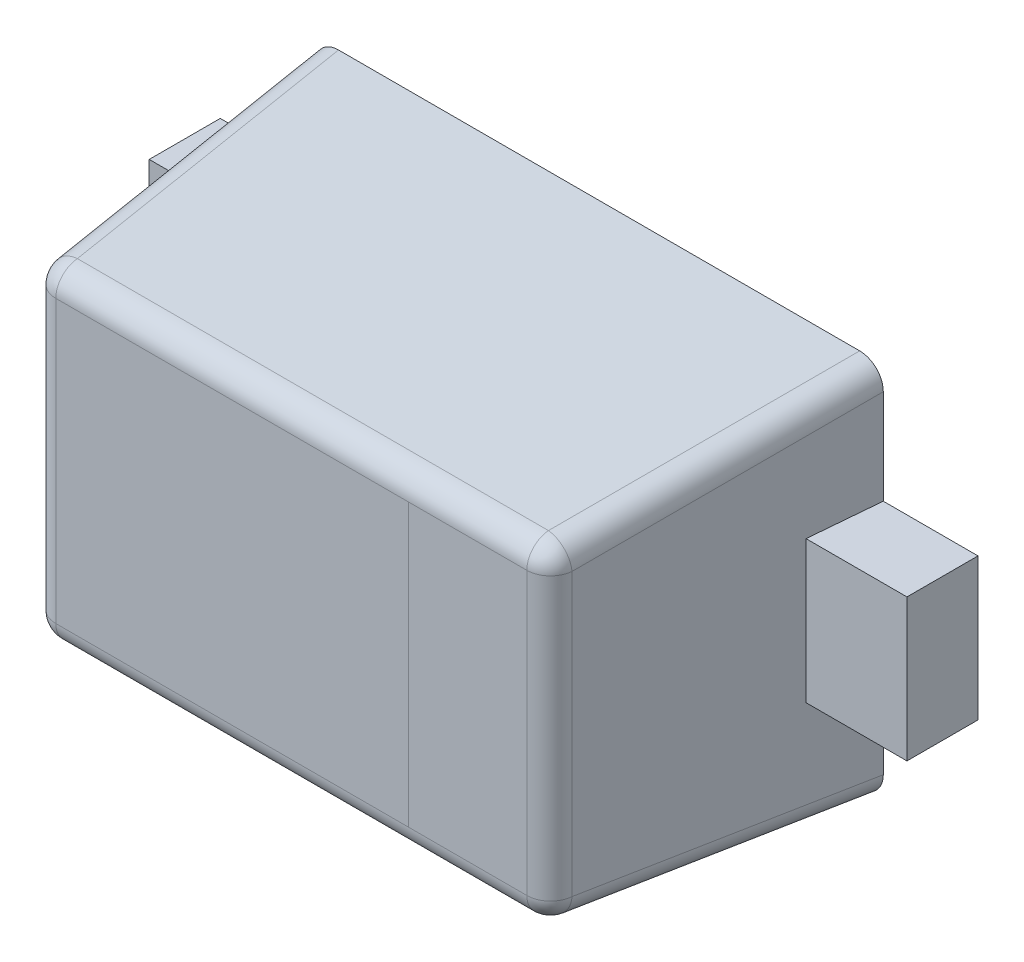
ISO-10303-21;
HEADER;
FILE_DESCRIPTION(('STEP AP214'),'2;1');
FILE_NAME('part.step','',(''),(''),'','','');
FILE_SCHEMA(('AUTOMOTIVE_DESIGN { 1 0 10303 214 1 1 1 1 }'));
ENDSEC;
DATA;
#1=APPLICATION_CONTEXT('core data for automotive mechanical design processes');
#2=APPLICATION_PROTOCOL_DEFINITION('international standard','automotive_design',2000,#1);
#3=PRODUCT_CONTEXT('',#1,'mechanical');
#4=PRODUCT('Part','Part','',(#3));
#5=PRODUCT_RELATED_PRODUCT_CATEGORY('part','',(#4));
#6=PRODUCT_DEFINITION_FORMATION('','',#4);
#7=PRODUCT_DEFINITION_CONTEXT('part definition',#1,'design');
#8=PRODUCT_DEFINITION('design','',#6,#7);
#9=PRODUCT_DEFINITION_SHAPE('','',#8);
#10=(LENGTH_UNIT() NAMED_UNIT(*) SI_UNIT(.MILLI.,.METRE.));
#11=(NAMED_UNIT(*) PLANE_ANGLE_UNIT() SI_UNIT($,.RADIAN.));
#12=(NAMED_UNIT(*) SI_UNIT($,.STERADIAN.) SOLID_ANGLE_UNIT());
#13=UNCERTAINTY_MEASURE_WITH_UNIT(LENGTH_MEASURE(1.E-05),#10,'distance_accuracy_value','');
#14=(GEOMETRIC_REPRESENTATION_CONTEXT(3) GLOBAL_UNCERTAINTY_ASSIGNED_CONTEXT((#13)) GLOBAL_UNIT_ASSIGNED_CONTEXT((#10,
#11,#12)) REPRESENTATION_CONTEXT('',''));
#15=CARTESIAN_POINT('',(0.,0.,0.));
#16=DIRECTION('',(0.,0.,1.));
#17=DIRECTION('',(1.,0.,0.));
#18=AXIS2_PLACEMENT_3D('',#15,#16,#17);
#19=CARTESIAN_POINT('',(8.12799989944324E-05,0.000121891586089262,0.649999999999999));
#20=DIRECTION('',(0.,-4.37113882867379E-08,0.999999999999999));
#21=DIRECTION('',(0.,-0.999999999999999,-4.37113882867379E-08));
#22=AXIS2_PLACEMENT_3D('',#19,#20,#21);
#23=PLANE('',#22);
#24=DIRECTION('',(1.,0.,0.));
#25=VECTOR('',#24,1.);
#26=CARTESIAN_POINT('',(0.543213648707144,-0.297193918421188,0.649999987003913));
#27=LINE('',#26,#25);
#28=CARTESIAN_POINT('',(-0.497234530008284,-0.297193918421189,0.649999987003913));
#29=VERTEX_POINT('',#28);
#30=CARTESIAN_POINT('',(0.247397090006273,-0.297193918421189,0.649999987003913));
#31=VERTEX_POINT('',#30);
#32=EDGE_CURVE('E11',#29,#31,#27,.T.);
#33=ORIENTED_EDGE('',*,*,#32,.T.);
#34=DIRECTION('',(0.,0.999999999999999,4.37113882867379E-08));
#35=VECTOR('',#34,1.);
#36=CARTESIAN_POINT('',(0.247397090006273,0.000121891586089307,0.649999999999999));
#37=LINE('',#36,#35);
#38=CARTESIAN_POINT('',(0.247397090006273,0.297437701593367,0.650000012996086));
#39=VERTEX_POINT('',#38);
#40=EDGE_CURVE('E23',#31,#39,#37,.T.);
#41=ORIENTED_EDGE('',*,*,#40,.T.);
#42=DIRECTION('',(-1.,0.,0.));
#43=VECTOR('',#42,1.);
#44=CARTESIAN_POINT('',(-0.543051088709155,0.297437701593367,0.650000012996086));
#45=LINE('',#44,#43);
#46=CARTESIAN_POINT('',(-0.497234530008284,0.297437701593367,0.650000012996086));
#47=VERTEX_POINT('',#46);
#48=EDGE_CURVE('E333',#39,#47,#45,.T.);
#49=ORIENTED_EDGE('',*,*,#48,.T.);
#50=DIRECTION('',(0.,-0.999999999999999,-4.37113882867379E-08));
#51=VECTOR('',#50,1.);
#52=CARTESIAN_POINT('',(-0.497234530008284,-0.34301047712206,0.649999985001207));
#53=LINE('',#52,#51);
#54=EDGE_CURVE('E331',#47,#29,#53,.T.);
#55=ORIENTED_EDGE('',*,*,#54,.T.);
#56=EDGE_LOOP('',(#33,#41,#49,#55));
#57=FACE_BOUND('',#56,.T.);
#58=ADVANCED_FACE('F16',(#57),#23,.T.);
#59=CARTESIAN_POINT('',(-0.599918720001006,-0.399878080001508,-1.74845553146952E-08));
#60=DIRECTION('',(-0.996194698091746,-3.80969851266194E-09,0.0871557427476583));
#61=DIRECTION('',(-0.0871557427476584,4.35450532574779E-08,-0.996194698091745));
#62=AXIS2_PLACEMENT_3D('',#59,#60,#61);
#63=PLANE('',#62);
#64=DIRECTION('',(0.0871557427476584,-4.35450532471426E-08,0.996194698091745));
#65=VECTOR('',#64,1.);
#66=CARTESIAN_POINT('',(-0.599918720001006,-0.149878080001508,-6.55670824558469E-09));
#67=LINE('',#66,#65);
#68=CARTESIAN_POINT('',(-0.599918720001005,-0.149878080001508,-6.55670824301069E-09));
#69=VERTEX_POINT('',#68);
#70=CARTESIAN_POINT('',(-0.586795420472117,-0.149878086558216,0.149999993443292));
#71=VERTEX_POINT('',#70);
#72=EDGE_CURVE('E148',#69,#71,#67,.T.);
#73=ORIENTED_EDGE('',*,*,#72,.F.);
#74=DIRECTION('',(0.,-0.999999999999999,-4.37113882867379E-08));
#75=VECTOR('',#74,1.);
#76=CARTESIAN_POINT('',(-0.599918720001006,-0.399878080001508,-1.74845553146952E-08));
#77=LINE('',#76,#75);
#78=CARTESIAN_POINT('',(-0.599918720001006,-0.350068345096921,-1.53073026518213E-08));
#79=VERTEX_POINT('',#78);
#80=EDGE_CURVE('E327',#69,#79,#77,.T.);
#81=ORIENTED_EDGE('',*,*,#80,.T.);
#82=DIRECTION('',(0.0868265938642478,0.086826550483645,0.992432512934277));
#83=VECTOR('',#82,1.);
#84=CARTESIAN_POINT('',(-0.600294228489686,-0.350443853397988,-0.00429209698946498));
#85=LINE('',#84,#83);
#86=CARTESIAN_POINT('',(-0.547044264912871,-0.297193916426104,0.604357774141296));
#87=VERTEX_POINT('',#86);
#88=EDGE_CURVE('E324',#79,#87,#85,.T.);
#89=ORIENTED_EDGE('',*,*,#88,.T.);
#90=DIRECTION('',(0.,0.999999999999999,4.37113882867379E-08));
#91=VECTOR('',#90,1.);
#92=CARTESIAN_POINT('',(-0.547044264912871,0.343254262289323,0.604357802136175));
#93=LINE('',#92,#91);
#94=CARTESIAN_POINT('',(-0.547044264912871,0.297437703588452,0.604357800133469));
#95=VERTEX_POINT('',#94);
#96=EDGE_CURVE('E322',#87,#95,#93,.T.);
#97=ORIENTED_EDGE('',*,*,#96,.T.);
#98=DIRECTION('',(-0.0868265938642478,0.0868266372448505,-0.992432505343655));
#99=VECTOR('',#98,1.);
#100=CARTESIAN_POINT('',(-0.594263142568032,0.344656604835272,0.0646435609212895));
#101=LINE('',#100,#99);
#102=CARTESIAN_POINT('',(-0.599918720001006,0.350312185093904,1.53073026518213E-08));
#103=VERTEX_POINT('',#102);
#104=EDGE_CURVE('E320',#95,#103,#101,.T.);
#105=ORIENTED_EDGE('',*,*,#104,.T.);
#106=DIRECTION('',(0.,-0.999999999999999,-4.37113882867379E-08));
#107=VECTOR('',#106,1.);
#108=CARTESIAN_POINT('',(-0.599918720001006,-0.399878080001508,-1.74845553146952E-08));
#109=LINE('',#108,#107);
#110=CARTESIAN_POINT('',(-0.599918720001006,0.150121919998492,6.55670824301069E-09));
#111=VERTEX_POINT('',#110);
#112=EDGE_CURVE('E318',#103,#111,#109,.T.);
#113=ORIENTED_EDGE('',*,*,#112,.T.);
#114=DIRECTION('',(-0.0871557427476584,4.35450532471426E-08,-0.996194698091745));
#115=VECTOR('',#114,1.);
#116=CARTESIAN_POINT('',(-0.599918720001006,0.150121919998491,6.55670823734788E-09));
#117=LINE('',#116,#115);
#118=CARTESIAN_POINT('',(-0.586795420472117,0.150121913441783,0.150000006556708));
#119=VERTEX_POINT('',#118);
#120=EDGE_CURVE('E315',#119,#111,#117,.T.);
#121=ORIENTED_EDGE('',*,*,#120,.F.);
#122=DIRECTION('',(0.,-0.999999999999999,-4.37113882867379E-08));
#123=VECTOR('',#122,1.);
#124=CARTESIAN_POINT('',(-0.586795420472117,-0.399878086558216,0.149999982515444));
#125=LINE('',#124,#123);
#126=EDGE_CURVE('E313',#119,#71,#125,.T.);
#127=ORIENTED_EDGE('',*,*,#126,.T.);
#128=EDGE_LOOP('',(#73,#81,#89,#97,#105,#113,#121,#127));
#129=FACE_BOUND('',#128,.T.);
#130=ADVANCED_FACE('F394',(#129),#63,.T.);
#131=CARTESIAN_POINT('',(0.600081279998994,-0.399878080001508,-1.74845553146952E-08));
#132=DIRECTION('',(0.996194698091746,-3.80969851266194E-09,0.0871557427476583));
#133=DIRECTION('',(-0.0871557427476584,-4.35450532574779E-08,0.996194698091745));
#134=AXIS2_PLACEMENT_3D('',#131,#132,#133);
#135=PLANE('',#134);
#136=DIRECTION('',(0.0871557427476584,4.35450532678133E-08,-0.996194698091745));
#137=VECTOR('',#136,1.);
#138=CARTESIAN_POINT('',(0.600081279998994,-0.149878080001508,-6.55670824043668E-09));
#139=LINE('',#138,#137);
#140=CARTESIAN_POINT('',(0.586957980470106,-0.149878086558216,0.149999993443292));
#141=VERTEX_POINT('',#140);
#142=CARTESIAN_POINT('',(0.600081279998994,-0.149878080001508,-6.55670824301068E-09));
#143=VERTEX_POINT('',#142);
#144=EDGE_CURVE('E310',#141,#143,#139,.T.);
#145=ORIENTED_EDGE('',*,*,#144,.F.);
#146=DIRECTION('',(0.,0.999999999999999,4.37113882867379E-08));
#147=VECTOR('',#146,1.);
#148=CARTESIAN_POINT('',(0.586957980470106,-0.399878086558216,0.149999982515444));
#149=LINE('',#148,#147);
#150=CARTESIAN_POINT('',(0.586957980470106,0.150121913441783,0.150000006556708));
#151=VERTEX_POINT('',#150);
#152=EDGE_CURVE('E307',#141,#151,#149,.T.);
#153=ORIENTED_EDGE('',*,*,#152,.T.);
#154=DIRECTION('',(-0.0871557427476584,-4.35450532678133E-08,0.996194698091745));
#155=VECTOR('',#154,1.);
#156=CARTESIAN_POINT('',(0.600081279998994,0.150121919998492,6.55670824867349E-09));
#157=LINE('',#156,#155);
#158=CARTESIAN_POINT('',(0.600081279998994,0.150121919998492,6.55670824301069E-09));
#159=VERTEX_POINT('',#158);
#160=EDGE_CURVE('E305',#159,#151,#157,.T.);
#161=ORIENTED_EDGE('',*,*,#160,.F.);
#162=DIRECTION('',(0.,0.999999999999999,4.37113882867379E-08));
#163=VECTOR('',#162,1.);
#164=CARTESIAN_POINT('',(0.600081279998994,-0.399878080001508,-1.74845553146952E-08));
#165=LINE('',#164,#163);
#166=CARTESIAN_POINT('',(0.600081279998994,0.350312185093904,1.53073026518213E-08));
#167=VERTEX_POINT('',#166);
#168=EDGE_CURVE('E302',#159,#167,#165,.T.);
#169=ORIENTED_EDGE('',*,*,#168,.T.);
#170=DIRECTION('',(-0.0868265938642478,-0.0868266372448505,0.992432505343655));
#171=VECTOR('',#170,1.);
#172=CARTESIAN_POINT('',(0.594425702566021,0.344656604835272,0.0646435609212895));
#173=LINE('',#172,#171);
#174=CARTESIAN_POINT('',(0.54720682491086,0.297437703588452,0.604357800133469));
#175=VERTEX_POINT('',#174);
#176=EDGE_CURVE('E300',#167,#175,#173,.T.);
#177=ORIENTED_EDGE('',*,*,#176,.T.);
#178=DIRECTION('',(0.,-0.999999999999999,-4.37113882867379E-08));
#179=VECTOR('',#178,1.);
#180=CARTESIAN_POINT('',(0.54720682491086,-0.343010475126975,0.60435777213859));
#181=LINE('',#180,#179);
#182=CARTESIAN_POINT('',(0.54720682491086,-0.297193916426104,0.604357774141296));
#183=VERTEX_POINT('',#182);
#184=EDGE_CURVE('E297',#175,#183,#181,.T.);
#185=ORIENTED_EDGE('',*,*,#184,.T.);
#186=DIRECTION('',(0.0868265938642478,-0.0868265504836449,-0.992432512934277));
#187=VECTOR('',#186,1.);
#188=CARTESIAN_POINT('',(0.600456788487675,-0.350443853397988,-0.00429209698946498));
#189=LINE('',#188,#187);
#190=CARTESIAN_POINT('',(0.600081279998994,-0.350068345096921,-1.53073026518213E-08));
#191=VERTEX_POINT('',#190);
#192=EDGE_CURVE('E295',#183,#191,#189,.T.);
#193=ORIENTED_EDGE('',*,*,#192,.T.);
#194=DIRECTION('',(0.,0.999999999999999,4.37113882867379E-08));
#195=VECTOR('',#194,1.);
#196=CARTESIAN_POINT('',(0.600081279998994,-0.399878080001508,-1.74845553146952E-08));
#197=LINE('',#196,#195);
#198=EDGE_CURVE('E292',#191,#143,#197,.T.);
#199=ORIENTED_EDGE('',*,*,#198,.T.);
#200=EDGE_LOOP('',(#145,#153,#161,#169,#177,#185,#193,#199));
#201=FACE_BOUND('',#200,.T.);
#202=ADVANCED_FACE('F413',(#201),#135,.T.);
#203=CARTESIAN_POINT('',(0.600081279998994,-0.399878080001508,-1.74845553146952E-08));
#204=DIRECTION('',(0.,-0.996194701901443,0.087155699202605));
#205=DIRECTION('',(0.,-0.087155699202605,-0.996194701901443));
#206=AXIS2_PLACEMENT_3D('',#203,#204,#205);
#207=PLANE('',#206);
#208=DIRECTION('',(-1.,0.,0.));
#209=VECTOR('',#208,1.);
#210=CARTESIAN_POINT('',(-0.543051088709155,-0.347003651330691,0.604357771964043));
#211=LINE('',#210,#209);
#212=CARTESIAN_POINT('',(0.497397090006272,-0.347003651330691,0.604357771964043));
#213=VERTEX_POINT('',#212);
#214=CARTESIAN_POINT('',(-0.497234530008284,-0.347003651330691,0.604357771964043));
#215=VERTEX_POINT('',#214);
#216=EDGE_CURVE('E290',#213,#215,#211,.T.);
#217=ORIENTED_EDGE('',*,*,#216,.T.);
#218=DIRECTION('',(-0.0868265938642478,-0.086826550483645,-0.992432512934277));
#219=VECTOR('',#218,1.);
#220=CARTESIAN_POINT('',(-0.541437864702618,-0.391206963940003,0.0991113425191456));
#221=LINE('',#220,#219);
#222=CARTESIAN_POINT('',(-0.550108985096418,-0.399878080001508,-1.74845553146952E-08));
#223=VERTEX_POINT('',#222);
#224=EDGE_CURVE('E288',#215,#223,#221,.T.);
#225=ORIENTED_EDGE('',*,*,#224,.T.);
#226=DIRECTION('',(1.,0.,0.));
#227=VECTOR('',#226,1.);
#228=CARTESIAN_POINT('',(0.600081279998994,-0.399878080001508,-1.74845553146952E-08));
#229=LINE('',#228,#227);
#230=CARTESIAN_POINT('',(0.550271545094407,-0.399878080001508,-1.74845553146952E-08));
#231=VERTEX_POINT('',#230);
#232=EDGE_CURVE('E285',#223,#231,#229,.T.);
#233=ORIENTED_EDGE('',*,*,#232,.T.);
#234=DIRECTION('',(-0.0868265938642478,0.0868265504836449,0.992432512934277));
#235=VECTOR('',#234,1.);
#236=CARTESIAN_POINT('',(0.550647053583088,-0.400253588302576,-0.00429209916671765));
#237=LINE('',#236,#235);
#238=EDGE_CURVE('E282',#231,#213,#237,.T.);
#239=ORIENTED_EDGE('',*,*,#238,.T.);
#240=EDGE_LOOP('',(#217,#225,#233,#239));
#241=FACE_BOUND('',#240,.T.);
#242=ADVANCED_FACE('F383',(#241),#207,.T.);
#243=CARTESIAN_POINT('',(0.600081279998994,0.400121919998491,1.74845553146952E-08));
#244=DIRECTION('',(0.,0.996194694282046,0.0871557862927115));
#245=DIRECTION('',(0.,-0.0871557862927115,0.996194694282046));
#246=AXIS2_PLACEMENT_3D('',#243,#244,#245);
#247=PLANE('',#246);
#248=DIRECTION('',(-1.,0.,0.));
#249=VECTOR('',#248,1.);
#250=CARTESIAN_POINT('',(0.600081279998994,0.400121919998491,1.74845553146952E-08));
#251=LINE('',#250,#249);
#252=CARTESIAN_POINT('',(0.550271545094407,0.400121919998491,1.74845553146952E-08));
#253=VERTEX_POINT('',#252);
#254=CARTESIAN_POINT('',(-0.550108985096418,0.400121919998491,1.74845553146952E-08));
#255=VERTEX_POINT('',#254);
#256=EDGE_CURVE('E280',#253,#255,#251,.T.);
#257=ORIENTED_EDGE('',*,*,#256,.T.);
#258=DIRECTION('',(0.0868265938642478,-0.0868266372448505,0.992432505343655));
#259=VECTOR('',#258,1.);
#260=CARTESIAN_POINT('',(-0.541437864702618,0.391450795272396,0.0991113767302028));
#261=LINE('',#260,#259);
#262=CARTESIAN_POINT('',(-0.497234530008283,0.347247438493039,0.604357802310722));
#263=VERTEX_POINT('',#262);
#264=EDGE_CURVE('E277',#255,#263,#261,.T.);
#265=ORIENTED_EDGE('',*,*,#264,.T.);
#266=DIRECTION('',(1.,0.,0.));
#267=VECTOR('',#266,1.);
#268=CARTESIAN_POINT('',(0.543213648707144,0.347247438493039,0.604357802310722));
#269=LINE('',#268,#267);
#270=CARTESIAN_POINT('',(0.497397090006273,0.347247438493039,0.604357802310722));
#271=VERTEX_POINT('',#270);
#272=EDGE_CURVE('E275',#263,#271,#269,.T.);
#273=ORIENTED_EDGE('',*,*,#272,.T.);
#274=DIRECTION('',(0.0868265938642478,0.0868266372448505,-0.992432505343655));
#275=VECTOR('',#274,1.);
#276=CARTESIAN_POINT('',(0.550647053583088,0.400497428674785,-0.00429206416477902));
#277=LINE('',#276,#275);
#278=EDGE_CURVE('E272',#271,#253,#277,.T.);
#279=ORIENTED_EDGE('',*,*,#278,.T.);
#280=EDGE_LOOP('',(#257,#265,#273,#279));
#281=FACE_BOUND('',#280,.T.);
#282=ADVANCED_FACE('F355',(#281),#247,.T.);
#283=CARTESIAN_POINT('',(8.12799989944324E-05,0.000121891586089262,0.649999999999999));
#284=DIRECTION('',(0.,-4.37113882867379E-08,0.999999999999999));
#285=DIRECTION('',(0.,-0.999999999999999,-4.37113882867379E-08));
#286=AXIS2_PLACEMENT_3D('',#283,#284,#285);
#287=PLANE('',#286);
#288=ORIENTED_EDGE('',*,*,#40,.F.);
#289=DIRECTION('',(1.,0.,0.));
#290=VECTOR('',#289,1.);
#291=CARTESIAN_POINT('',(0.543213648707144,-0.297193918421188,0.649999987003913));
#292=LINE('',#291,#290);
#293=CARTESIAN_POINT('',(0.497397090006273,-0.297193918421188,0.649999987003913));
#294=VERTEX_POINT('',#293);
#295=EDGE_CURVE('E270',#31,#294,#292,.T.);
#296=ORIENTED_EDGE('',*,*,#295,.T.);
#297=DIRECTION('',(0.,0.999999999999999,4.37113882867379E-08));
#298=VECTOR('',#297,1.);
#299=CARTESIAN_POINT('',(0.497397090006273,0.343254260294238,0.650000014998792));
#300=LINE('',#299,#298);
#301=CARTESIAN_POINT('',(0.497397090006273,0.297437701593367,0.650000012996086));
#302=VERTEX_POINT('',#301);
#303=EDGE_CURVE('E267',#294,#302,#300,.T.);
#304=ORIENTED_EDGE('',*,*,#303,.T.);
#305=DIRECTION('',(-1.,0.,0.));
#306=VECTOR('',#305,1.);
#307=CARTESIAN_POINT('',(-0.543051088709155,0.297437701593367,0.650000012996086));
#308=LINE('',#307,#306);
#309=EDGE_CURVE('E264',#302,#39,#308,.T.);
#310=ORIENTED_EDGE('',*,*,#309,.T.);
#311=EDGE_LOOP('',(#288,#296,#304,#310));
#312=FACE_BOUND('',#311,.T.);
#313=ADVANCED_FACE('F341',(#312),#287,.T.);
#314=CARTESIAN_POINT('',(8.12799989944324E-05,0.000121919998491649,0.));
#315=DIRECTION('',(0.,-4.37113882867379E-08,0.999999999999999));
#316=DIRECTION('',(0.,-0.999999999999999,-4.37113882867379E-08));
#317=AXIS2_PLACEMENT_3D('',#314,#315,#316);
#318=PLANE('',#317);
#319=ORIENTED_EDGE('',*,*,#168,.F.);
#320=DIRECTION('',(-1.,0.,0.));
#321=VECTOR('',#320,1.);
#322=CARTESIAN_POINT('',(0.800081279998994,0.150121919998492,6.55670824301069E-09));
#323=LINE('',#322,#321);
#324=CARTESIAN_POINT('',(0.800081279998994,0.150121919998492,6.55670824301069E-09));
#325=VERTEX_POINT('',#324);
#326=EDGE_CURVE('E261',#325,#159,#323,.T.);
#327=ORIENTED_EDGE('',*,*,#326,.F.);
#328=DIRECTION('',(0.,0.999999999999999,4.37113882867379E-08));
#329=VECTOR('',#328,1.);
#330=CARTESIAN_POINT('',(0.800081279998994,-0.149878080001508,-6.55670824301068E-09));
#331=LINE('',#330,#329);
#332=CARTESIAN_POINT('',(0.800081279998994,-0.149878080001508,-6.55670824301068E-09));
#333=VERTEX_POINT('',#332);
#334=EDGE_CURVE('E258',#333,#325,#331,.T.);
#335=ORIENTED_EDGE('',*,*,#334,.F.);
#336=DIRECTION('',(1.,0.,0.));
#337=VECTOR('',#336,1.);
#338=CARTESIAN_POINT('',(0.800081279998994,-0.149878080001508,-6.55670824301068E-09));
#339=LINE('',#338,#337);
#340=EDGE_CURVE('E253',#143,#333,#339,.T.);
#341=ORIENTED_EDGE('',*,*,#340,.F.);
#342=ORIENTED_EDGE('',*,*,#198,.F.);
#343=CARTESIAN_POINT('',(0.600081279998994,-0.350068345096921,-1.53073026518213E-08));
#344=CARTESIAN_POINT('',(0.600081279998995,-0.379291926782774,-1.65847059780208E-08));
#345=CARTESIAN_POINT('',(0.57949512678026,-0.399878080001508,-1.74845553146952E-08));
#346=CARTESIAN_POINT('',(0.550271545094407,-0.399878080001508,-1.74845553146952E-08));
#347=(BOUNDED_CURVE() B_SPLINE_CURVE(3,(#343,#344,#345,#346),.UNSPECIFIED.,.F.,
.F.) B_SPLINE_CURVE_WITH_KNOTS((4,4),(5.50158524205542,7.06478537230376),
.UNSPECIFIED.) CURVE() GEOMETRIC_REPRESENTATION_ITEM() RATIONAL_B_SPLINE_CURVE((1.,
0.806524890385348,0.806524890385348,1.)) REPRESENTATION_ITEM(''));
#348=EDGE_CURVE('E246',#191,#231,#347,.T.);
#349=ORIENTED_EDGE('',*,*,#348,.T.);
#350=ORIENTED_EDGE('',*,*,#232,.F.);
#351=CARTESIAN_POINT('',(-0.550108985096418,-0.399878080001508,-1.74845553146952E-08));
#352=CARTESIAN_POINT('',(-0.579332566782271,-0.399878080001508,-1.74845553146952E-08));
#353=CARTESIAN_POINT('',(-0.599918720001006,-0.379291926782774,-1.65847059780208E-08));
#354=CARTESIAN_POINT('',(-0.599918720001006,-0.350068345096921,-1.53073026518213E-08));
#355=(BOUNDED_CURVE() B_SPLINE_CURVE(3,(#351,#352,#353,#354),.UNSPECIFIED.,.F.,
.F.) B_SPLINE_CURVE_WITH_KNOTS((4,4),(5.50158524205542,7.06478537230376),
.UNSPECIFIED.) CURVE() GEOMETRIC_REPRESENTATION_ITEM() RATIONAL_B_SPLINE_CURVE((1.,
0.806524890385348,0.806524890385348,1.)) REPRESENTATION_ITEM(''));
#356=EDGE_CURVE('E241',#223,#79,#355,.T.);
#357=ORIENTED_EDGE('',*,*,#356,.T.);
#358=ORIENTED_EDGE('',*,*,#80,.F.);
#359=DIRECTION('',(1.,0.,0.));
#360=VECTOR('',#359,1.);
#361=CARTESIAN_POINT('',(0.800081279998994,-0.149878080001508,-6.55670824301068E-09));
#362=LINE('',#361,#360);
#363=CARTESIAN_POINT('',(-0.799918720001006,-0.149878080001508,-6.55670824301069E-09));
#364=VERTEX_POINT('',#363);
#365=EDGE_CURVE('E239',#364,#69,#362,.T.);
#366=ORIENTED_EDGE('',*,*,#365,.F.);
#367=DIRECTION('',(0.,-0.999999999999999,-4.37113882867379E-08));
#368=VECTOR('',#367,1.);
#369=CARTESIAN_POINT('',(-0.799918720001006,-0.149878080001508,-6.55670824301069E-09));
#370=LINE('',#369,#368);
#371=CARTESIAN_POINT('',(-0.799918720001006,0.150121919998491,6.55670824301068E-09));
#372=VERTEX_POINT('',#371);
#373=EDGE_CURVE('E160',#372,#364,#370,.T.);
#374=ORIENTED_EDGE('',*,*,#373,.F.);
#375=DIRECTION('',(-1.,0.,0.));
#376=VECTOR('',#375,1.);
#377=CARTESIAN_POINT('',(0.800081279998994,0.150121919998492,6.55670824301069E-09));
#378=LINE('',#377,#376);
#379=EDGE_CURVE('E232',#111,#372,#378,.T.);
#380=ORIENTED_EDGE('',*,*,#379,.F.);
#381=ORIENTED_EDGE('',*,*,#112,.F.);
#382=CARTESIAN_POINT('',(-0.599918720001006,0.350312185093904,1.53073026518213E-08));
#383=CARTESIAN_POINT('',(-0.599918720001006,0.379535766779757,1.65847059780208E-08));
#384=CARTESIAN_POINT('',(-0.579332566782271,0.400121919998491,1.74845553146952E-08));
#385=CARTESIAN_POINT('',(-0.550108985096418,0.400121919998491,1.74845553146952E-08));
#386=(BOUNDED_CURVE() B_SPLINE_CURVE(3,(#382,#383,#384,#385),.UNSPECIFIED.,.F.,
.F.) B_SPLINE_CURVE_WITH_KNOTS((4,4),(5.50158524205542,7.06478537230376),
.UNSPECIFIED.) CURVE() GEOMETRIC_REPRESENTATION_ITEM() RATIONAL_B_SPLINE_CURVE((1.,
0.806524890385348,0.806524890385348,1.)) REPRESENTATION_ITEM(''));
#387=EDGE_CURVE('E224',#103,#255,#386,.T.);
#388=ORIENTED_EDGE('',*,*,#387,.T.);
#389=ORIENTED_EDGE('',*,*,#256,.F.);
#390=CARTESIAN_POINT('',(0.550271545094407,0.400121919998491,1.74845553146952E-08));
#391=CARTESIAN_POINT('',(0.57949512678026,0.400121919998491,1.74845553146952E-08));
#392=CARTESIAN_POINT('',(0.600081279998995,0.379535766779757,1.65847059780208E-08));
#393=CARTESIAN_POINT('',(0.600081279998994,0.350312185093904,1.53073026518213E-08));
#394=(BOUNDED_CURVE() B_SPLINE_CURVE(3,(#390,#391,#392,#393),.UNSPECIFIED.,.F.,
.F.) B_SPLINE_CURVE_WITH_KNOTS((4,4),(5.50158524205542,7.06478537230376),
.UNSPECIFIED.) CURVE() GEOMETRIC_REPRESENTATION_ITEM() RATIONAL_B_SPLINE_CURVE((1.,
0.806524890385348,0.806524890385348,1.)) REPRESENTATION_ITEM(''));
#395=EDGE_CURVE('E219',#253,#167,#394,.T.);
#396=ORIENTED_EDGE('',*,*,#395,.T.);
#397=EDGE_LOOP('',(#319,#327,#335,#341,#342,#349,#350,#357,#358,#366,#374,#380,#381,#388,#389,#396));
#398=FACE_BOUND('',#397,.T.);
#399=ADVANCED_FACE('F388',(#398),#318,.F.);
#400=CARTESIAN_POINT('',(0.550647053583088,-0.350443853207503,-0.0086498841268479));
#401=DIRECTION('',(0.0868265938642478,-0.0868265504836449,-0.992432512934277));
#402=DIRECTION('',(0.996194698091746,-3.8096985065904E-09,0.0871557427476583));
#403=AXIS2_PLACEMENT_3D('',#400,#401,#402);
#404=CYLINDRICAL_SURFACE('',#403,0.0500000000000001);
#405=ORIENTED_EDGE('',*,*,#348,.F.);
#406=ORIENTED_EDGE('',*,*,#192,.F.);
#407=CARTESIAN_POINT('',(0.497397090006272,-0.297193916235619,0.599999987003913));
#408=DIRECTION('',(-0.0868265938642475,0.0868265504836449,0.992432512934277));
#409=DIRECTION('',(0.,-0.996194701901443,0.087155699202605));
#410=AXIS2_PLACEMENT_3D('',#407,#408,#409);
#411=CIRCLE('',#410,0.05);
#412=EDGE_CURVE('E216',#213,#183,#411,.T.);
#413=ORIENTED_EDGE('',*,*,#412,.F.);
#414=ORIENTED_EDGE('',*,*,#238,.F.);
#415=EDGE_LOOP('',(#405,#406,#413,#414));
#416=FACE_BOUND('',#415,.T.);
#417=ADVANCED_FACE('F380',(#416),#404,.T.);
#418=CARTESIAN_POINT('',(8.12799989944861E-05,-0.297193916235619,0.599999987003913));
#419=DIRECTION('',(1.,0.,0.));
#420=DIRECTION('',(0.,0.999999999999999,4.37113882867379E-08));
#421=AXIS2_PLACEMENT_3D('',#418,#419,#420);
#422=CYLINDRICAL_SURFACE('',#421,0.05);
#423=CARTESIAN_POINT('',(-0.497234530008284,-0.297193916235619,0.599999987003913));
#424=DIRECTION('',(-1.,0.,0.));
#425=DIRECTION('',(0.,-0.999999999999999,-4.37113882867379E-08));
#426=AXIS2_PLACEMENT_3D('',#423,#424,#425);
#427=CIRCLE('',#426,0.05);
#428=EDGE_CURVE('E213',#215,#29,#427,.T.);
#429=ORIENTED_EDGE('',*,*,#428,.F.);
#430=ORIENTED_EDGE('',*,*,#216,.F.);
#431=CARTESIAN_POINT('',(0.497397090006273,-0.297193916235619,0.599999987003913));
#432=DIRECTION('',(1.,0.,0.));
#433=DIRECTION('',(0.,0.999999999999999,4.37113882867379E-08));
#434=AXIS2_PLACEMENT_3D('',#431,#432,#433);
#435=CIRCLE('',#434,0.05);
#436=EDGE_CURVE('E210',#294,#213,#435,.T.);
#437=ORIENTED_EDGE('',*,*,#436,.F.);
#438=ORIENTED_EDGE('',*,*,#295,.F.);
#439=ORIENTED_EDGE('',*,*,#32,.F.);
#440=EDGE_LOOP('',(#429,#430,#437,#438,#439));
#441=FACE_BOUND('',#440,.T.);
#442=ADVANCED_FACE('F372',(#441),#422,.T.);
#443=CARTESIAN_POINT('',(-0.541437864702618,-0.341397228844931,0.0947535575590153));
#444=DIRECTION('',(-0.0868265938642478,-0.086826550483645,-0.992432512934277));
#445=DIRECTION('',(0.,0.996194701901443,-0.0871556992026051));
#446=AXIS2_PLACEMENT_3D('',#443,#444,#445);
#447=CYLINDRICAL_SURFACE('',#446,0.05);
#448=ORIENTED_EDGE('',*,*,#356,.F.);
#449=ORIENTED_EDGE('',*,*,#224,.F.);
#450=CARTESIAN_POINT('',(-0.497234530008284,-0.297193916235619,0.599999987003913));
#451=DIRECTION('',(0.0868265938642477,0.0868265504836449,0.992432512934277));
#452=DIRECTION('',(0.,-0.996194701901443,0.087155699202605));
#453=AXIS2_PLACEMENT_3D('',#450,#451,#452);
#454=CIRCLE('',#453,0.05);
#455=EDGE_CURVE('E207',#87,#215,#454,.T.);
#456=ORIENTED_EDGE('',*,*,#455,.F.);
#457=ORIENTED_EDGE('',*,*,#88,.F.);
#458=EDGE_LOOP('',(#448,#449,#456,#457));
#459=FACE_BOUND('',#458,.T.);
#460=ADVANCED_FACE('F392',(#459),#447,.T.);
#461=CARTESIAN_POINT('',(0.497397090006273,-0.297193916235619,0.599999987003913));
#462=DIRECTION('',(0.,-4.37113882867379E-08,0.999999999999999));
#463=DIRECTION('',(1.,0.,0.));
#464=AXIS2_PLACEMENT_3D('',#461,#462,#463);
#465=SPHERICAL_SURFACE('',#464,0.05);
#466=ORIENTED_EDGE('',*,*,#436,.T.);
#467=ORIENTED_EDGE('',*,*,#412,.T.);
#468=CARTESIAN_POINT('',(0.497397090006273,-0.297193916235619,0.599999987003913));
#469=DIRECTION('',(0.,0.999999999999999,4.37113893709401E-08));
#470=DIRECTION('',(0.,4.37113893709401E-08,-0.999999999999999));
#471=AXIS2_PLACEMENT_3D('',#468,#469,#470);
#472=CIRCLE('',#471,0.05);
#473=EDGE_CURVE('E204',#294,#183,#472,.T.);
#474=ORIENTED_EDGE('',*,*,#473,.F.);
#475=EDGE_LOOP('',(#466,#467,#474));
#476=FACE_BOUND('',#475,.T.);
#477=ADVANCED_FACE('F382',(#476),#465,.T.);
#478=CARTESIAN_POINT('',(-0.497234530008284,-0.297193916235619,0.599999987003913));
#479=DIRECTION('',(0.,-4.37113882867379E-08,0.999999999999999));
#480=DIRECTION('',(1.,0.,0.));
#481=AXIS2_PLACEMENT_3D('',#478,#479,#480);
#482=SPHERICAL_SURFACE('',#481,0.05);
#483=ORIENTED_EDGE('',*,*,#455,.T.);
#484=ORIENTED_EDGE('',*,*,#428,.T.);
#485=CARTESIAN_POINT('',(-0.497234530008284,-0.297193916235619,0.599999987003913));
#486=DIRECTION('',(0.,0.999999999999999,4.37113882867379E-08));
#487=DIRECTION('',(1.,0.,0.));
#488=AXIS2_PLACEMENT_3D('',#485,#486,#487);
#489=CIRCLE('',#488,0.05);
#490=EDGE_CURVE('E201',#87,#29,#489,.T.);
#491=ORIENTED_EDGE('',*,*,#490,.F.);
#492=EDGE_LOOP('',(#483,#484,#491));
#493=FACE_BOUND('',#492,.T.);
#494=ADVANCED_FACE('F370',(#493),#482,.T.);
#495=CARTESIAN_POINT('',(0.550647053583088,0.350687693960682,-0.0086498534794146));
#496=DIRECTION('',(0.0868265938642478,0.0868266372448505,-0.992432505343655));
#497=DIRECTION('',(0.,0.996194694282046,0.0871557862927116));
#498=AXIS2_PLACEMENT_3D('',#495,#496,#497);
#499=CYLINDRICAL_SURFACE('',#498,0.05);
#500=ORIENTED_EDGE('',*,*,#395,.F.);
#501=ORIENTED_EDGE('',*,*,#278,.F.);
#502=CARTESIAN_POINT('',(0.497397090006273,0.297437703778937,0.600000012996086));
#503=DIRECTION('',(-0.0868265938642477,-0.0868266372448503,0.992432505343655));
#504=DIRECTION('',(0.,-0.996194694282046,-0.0871557862927114));
#505=AXIS2_PLACEMENT_3D('',#502,#503,#504);
#506=CIRCLE('',#505,0.05);
#507=EDGE_CURVE('E198',#175,#271,#506,.T.);
#508=ORIENTED_EDGE('',*,*,#507,.F.);
#509=ORIENTED_EDGE('',*,*,#176,.F.);
#510=EDGE_LOOP('',(#500,#501,#508,#509));
#511=FACE_BOUND('',#510,.T.);
#512=ADVANCED_FACE('F353',(#511),#499,.T.);
#513=CARTESIAN_POINT('',(0.497397090006273,0.000121893771658677,0.599999999999999));
#514=DIRECTION('',(0.,0.999999999999999,4.37113882867379E-08));
#515=DIRECTION('',(-1.,0.,0.));
#516=AXIS2_PLACEMENT_3D('',#513,#514,#515);
#517=CYLINDRICAL_SURFACE('',#516,0.05);
#518=ORIENTED_EDGE('',*,*,#473,.T.);
#519=ORIENTED_EDGE('',*,*,#184,.F.);
#520=CARTESIAN_POINT('',(0.497397090006273,0.297437703778937,0.600000012996086));
#521=DIRECTION('',(0.,0.999999999999999,4.37113882867379E-08));
#522=DIRECTION('',(-1.,0.,0.));
#523=AXIS2_PLACEMENT_3D('',#520,#521,#522);
#524=CIRCLE('',#523,0.05);
#525=EDGE_CURVE('E195',#302,#175,#524,.T.);
#526=ORIENTED_EDGE('',*,*,#525,.F.);
#527=ORIENTED_EDGE('',*,*,#303,.F.);
#528=EDGE_LOOP('',(#518,#519,#526,#527));
#529=FACE_BOUND('',#528,.T.);
#530=ADVANCED_FACE('F414',(#529),#517,.T.);
#531=CARTESIAN_POINT('',(-0.497234530008284,0.000121893771658677,0.599999999999999));
#532=DIRECTION('',(0.,-0.999999999999999,-4.37113882867379E-08));
#533=DIRECTION('',(1.,0.,0.));
#534=AXIS2_PLACEMENT_3D('',#531,#532,#533);
#535=CYLINDRICAL_SURFACE('',#534,0.05);
#536=ORIENTED_EDGE('',*,*,#490,.T.);
#537=ORIENTED_EDGE('',*,*,#54,.F.);
#538=CARTESIAN_POINT('',(-0.497234530008284,0.297437703778936,0.600000012996086));
#539=DIRECTION('',(0.,0.999999999999999,4.37113872025357E-08));
#540=DIRECTION('',(0.,-4.37113872025357E-08,0.999999999999999));
#541=AXIS2_PLACEMENT_3D('',#538,#539,#540);
#542=CIRCLE('',#541,0.05);
#543=EDGE_CURVE('E192',#95,#47,#542,.T.);
#544=ORIENTED_EDGE('',*,*,#543,.F.);
#545=ORIENTED_EDGE('',*,*,#96,.F.);
#546=EDGE_LOOP('',(#536,#537,#544,#545));
#547=FACE_BOUND('',#546,.T.);
#548=ADVANCED_FACE('F367',(#547),#535,.T.);
#549=CARTESIAN_POINT('',(-0.544453407663445,0.344656605025757,0.0602857737839066));
#550=DIRECTION('',(-0.0868265938642478,0.0868266372448504,-0.992432505343655));
#551=DIRECTION('',(0.996194698091746,3.80969851699875E-09,-0.0871557427476583));
#552=AXIS2_PLACEMENT_3D('',#549,#550,#551);
#553=CYLINDRICAL_SURFACE('',#552,0.0500000000000001);
#554=ORIENTED_EDGE('',*,*,#387,.F.);
#555=ORIENTED_EDGE('',*,*,#104,.F.);
#556=CARTESIAN_POINT('',(-0.497234530008283,0.297437703778936,0.600000012996086));
#557=DIRECTION('',(0.0868265938642475,-0.0868266372448504,0.992432505343655));
#558=DIRECTION('',(0.,-0.996194694282046,-0.0871557862927115));
#559=AXIS2_PLACEMENT_3D('',#556,#557,#558);
#560=CIRCLE('',#559,0.05);
#561=EDGE_CURVE('E189',#263,#95,#560,.T.);
#562=ORIENTED_EDGE('',*,*,#561,.F.);
#563=ORIENTED_EDGE('',*,*,#264,.F.);
#564=EDGE_LOOP('',(#554,#555,#562,#563));
#565=FACE_BOUND('',#564,.T.);
#566=ADVANCED_FACE('F361',(#565),#553,.T.);
#567=CARTESIAN_POINT('',(0.497397090006273,0.297437703778937,0.600000012996086));
#568=DIRECTION('',(0.,-4.37113882867379E-08,0.999999999999999));
#569=DIRECTION('',(1.,0.,0.));
#570=AXIS2_PLACEMENT_3D('',#567,#568,#569);
#571=SPHERICAL_SURFACE('',#570,0.05);
#572=ORIENTED_EDGE('',*,*,#525,.T.);
#573=ORIENTED_EDGE('',*,*,#507,.T.);
#574=CARTESIAN_POINT('',(0.497397090006273,0.297437703778937,0.600000012996086));
#575=DIRECTION('',(-1.,0.,0.));
#576=DIRECTION('',(0.,0.999999999999999,4.37113882867379E-08));
#577=AXIS2_PLACEMENT_3D('',#574,#575,#576);
#578=CIRCLE('',#577,0.05);
#579=EDGE_CURVE('E186',#302,#271,#578,.T.);
#580=ORIENTED_EDGE('',*,*,#579,.F.);
#581=EDGE_LOOP('',(#572,#573,#580));
#582=FACE_BOUND('',#581,.T.);
#583=ADVANCED_FACE('F347',(#582),#571,.T.);
#584=CARTESIAN_POINT('',(-0.497234530008284,0.297437703778937,0.600000012996086));
#585=DIRECTION('',(0.,-4.37113882867379E-08,0.999999999999999));
#586=DIRECTION('',(1.,0.,0.));
#587=AXIS2_PLACEMENT_3D('',#584,#585,#586);
#588=SPHERICAL_SURFACE('',#587,0.05);
#589=ORIENTED_EDGE('',*,*,#561,.T.);
#590=ORIENTED_EDGE('',*,*,#543,.T.);
#591=CARTESIAN_POINT('',(-0.497234530008284,0.297437703778937,0.600000012996086));
#592=DIRECTION('',(1.,0.,0.));
#593=DIRECTION('',(0.,-0.999999999999999,-4.37113882867379E-08));
#594=AXIS2_PLACEMENT_3D('',#591,#592,#593);
#595=CIRCLE('',#594,0.05);
#596=EDGE_CURVE('E183',#263,#47,#595,.T.);
#597=ORIENTED_EDGE('',*,*,#596,.F.);
#598=EDGE_LOOP('',(#589,#590,#597));
#599=FACE_BOUND('',#598,.T.);
#600=ADVANCED_FACE('F364',(#599),#588,.T.);
#601=CARTESIAN_POINT('',(8.12799989943787E-05,0.297437703778937,0.600000012996086));
#602=DIRECTION('',(-1.,0.,0.));
#603=DIRECTION('',(0.,-0.999999999999999,-4.37113882867379E-08));
#604=AXIS2_PLACEMENT_3D('',#601,#602,#603);
#605=CYLINDRICAL_SURFACE('',#604,0.05);
#606=ORIENTED_EDGE('',*,*,#579,.T.);
#607=ORIENTED_EDGE('',*,*,#272,.F.);
#608=ORIENTED_EDGE('',*,*,#596,.T.);
#609=ORIENTED_EDGE('',*,*,#48,.F.);
#610=ORIENTED_EDGE('',*,*,#309,.F.);
#611=EDGE_LOOP('',(#606,#607,#608,#609,#610));
#612=FACE_BOUND('',#611,.T.);
#613=ADVANCED_FACE('F339',(#612),#605,.T.);
#614=CARTESIAN_POINT('',(0.800081279998994,-0.149878086558216,0.149999993443292));
#615=DIRECTION('',(-1.,0.,0.));
#616=DIRECTION('',(0.,-0.999999999999999,-4.37113882867379E-08));
#617=AXIS2_PLACEMENT_3D('',#614,#615,#616);
#618=PLANE('',#617);
#619=ORIENTED_EDGE('',*,*,#334,.T.);
#620=DIRECTION('',(0.,4.37113882867379E-08,-0.999999999999999));
#621=VECTOR('',#620,1.);
#622=CARTESIAN_POINT('',(0.800081279998994,0.150121913441783,0.150000006556708));
#623=LINE('',#622,#621);
#624=CARTESIAN_POINT('',(0.800081279998994,0.150121913441783,0.150000006556708));
#625=VERTEX_POINT('',#624);
#626=EDGE_CURVE('E180',#625,#325,#623,.T.);
#627=ORIENTED_EDGE('',*,*,#626,.F.);
#628=DIRECTION('',(0.,0.999999999999999,4.37113882867379E-08));
#629=VECTOR('',#628,1.);
#630=CARTESIAN_POINT('',(0.800081279998994,-0.149878086558216,0.149999993443292));
#631=LINE('',#630,#629);
#632=CARTESIAN_POINT('',(0.800081279998994,-0.149878086558216,0.149999993443292));
#633=VERTEX_POINT('',#632);
#634=EDGE_CURVE('E178',#633,#625,#631,.T.);
#635=ORIENTED_EDGE('',*,*,#634,.F.);
#636=DIRECTION('',(0.,4.37113882867379E-08,-0.999999999999999));
#637=VECTOR('',#636,1.);
#638=CARTESIAN_POINT('',(0.800081279998994,-0.149878086558216,0.149999993443292));
#639=LINE('',#638,#637);
#640=EDGE_CURVE('E175',#633,#333,#639,.T.);
#641=ORIENTED_EDGE('',*,*,#640,.T.);
#642=EDGE_LOOP('',(#619,#627,#635,#641));
#643=FACE_BOUND('',#642,.T.);
#644=ADVANCED_FACE('F407',(#643),#618,.F.);
#645=CARTESIAN_POINT('',(8.12799989944324E-05,0.000121913441783406,0.15));
#646=DIRECTION('',(0.,-4.37113882867379E-08,0.999999999999999));
#647=DIRECTION('',(0.,-0.999999999999999,-4.37113882867379E-08));
#648=AXIS2_PLACEMENT_3D('',#645,#646,#647);
#649=PLANE('',#648);
#650=ORIENTED_EDGE('',*,*,#152,.F.);
#651=DIRECTION('',(1.,0.,0.));
#652=VECTOR('',#651,1.);
#653=CARTESIAN_POINT('',(0.800081279998994,-0.149878086558216,0.149999993443292));
#654=LINE('',#653,#652);
#655=EDGE_CURVE('E172',#141,#633,#654,.T.);
#656=ORIENTED_EDGE('',*,*,#655,.T.);
#657=ORIENTED_EDGE('',*,*,#634,.T.);
#658=DIRECTION('',(-1.,0.,0.));
#659=VECTOR('',#658,1.);
#660=CARTESIAN_POINT('',(0.800081279998994,0.150121913441783,0.150000006556708));
#661=LINE('',#660,#659);
#662=EDGE_CURVE('E167',#625,#151,#661,.T.);
#663=ORIENTED_EDGE('',*,*,#662,.T.);
#664=EDGE_LOOP('',(#650,#656,#657,#663));
#665=FACE_BOUND('',#664,.T.);
#666=ADVANCED_FACE('F518',(#665),#649,.T.);
#667=CARTESIAN_POINT('',(0.800081279998994,0.150121913441783,0.150000006556708));
#668=DIRECTION('',(0.,-0.999999999999999,-4.37113882867379E-08));
#669=DIRECTION('',(1.,0.,0.));
#670=AXIS2_PLACEMENT_3D('',#667,#668,#669);
#671=PLANE('',#670);
#672=ORIENTED_EDGE('',*,*,#326,.T.);
#673=ORIENTED_EDGE('',*,*,#160,.T.);
#674=ORIENTED_EDGE('',*,*,#662,.F.);
#675=ORIENTED_EDGE('',*,*,#626,.T.);
#676=EDGE_LOOP('',(#672,#673,#674,#675));
#677=FACE_BOUND('',#676,.T.);
#678=ADVANCED_FACE('F403',(#677),#671,.F.);
#679=CARTESIAN_POINT('',(0.800081279998994,-0.149878086558216,0.149999993443292));
#680=DIRECTION('',(0.,0.999999999999999,4.37113882867379E-08));
#681=DIRECTION('',(-1.,0.,0.));
#682=AXIS2_PLACEMENT_3D('',#679,#680,#681);
#683=PLANE('',#682);
#684=ORIENTED_EDGE('',*,*,#655,.F.);
#685=ORIENTED_EDGE('',*,*,#144,.T.);
#686=ORIENTED_EDGE('',*,*,#340,.T.);
#687=ORIENTED_EDGE('',*,*,#640,.F.);
#688=EDGE_LOOP('',(#684,#685,#686,#687));
#689=FACE_BOUND('',#688,.T.);
#690=ADVANCED_FACE('F411',(#689),#683,.F.);
#691=CARTESIAN_POINT('',(8.12799989944324E-05,0.000121913441783406,0.15));
#692=DIRECTION('',(0.,-4.37113882867379E-08,0.999999999999999));
#693=DIRECTION('',(0.,-0.999999999999999,-4.37113882867379E-08));
#694=AXIS2_PLACEMENT_3D('',#691,#692,#693);
#695=PLANE('',#694);
#696=ORIENTED_EDGE('',*,*,#126,.F.);
#697=DIRECTION('',(-1.,0.,0.));
#698=VECTOR('',#697,1.);
#699=CARTESIAN_POINT('',(0.800081279998994,0.150121913441783,0.150000006556708));
#700=LINE('',#699,#698);
#701=CARTESIAN_POINT('',(-0.799918720001006,0.150121913441783,0.150000006556708));
#702=VERTEX_POINT('',#701);
#703=EDGE_CURVE('E165',#119,#702,#700,.T.);
#704=ORIENTED_EDGE('',*,*,#703,.T.);
#705=DIRECTION('',(0.,-0.999999999999999,-4.37113882867379E-08));
#706=VECTOR('',#705,1.);
#707=CARTESIAN_POINT('',(-0.799918720001006,-0.149878086558216,0.149999993443292));
#708=LINE('',#707,#706);
#709=CARTESIAN_POINT('',(-0.799918720001006,-0.149878086558216,0.149999993443292));
#710=VERTEX_POINT('',#709);
#711=EDGE_CURVE('E153',#702,#710,#708,.T.);
#712=ORIENTED_EDGE('',*,*,#711,.T.);
#713=DIRECTION('',(1.,0.,0.));
#714=VECTOR('',#713,1.);
#715=CARTESIAN_POINT('',(0.800081279998994,-0.149878086558216,0.149999993443292));
#716=LINE('',#715,#714);
#717=EDGE_CURVE('E142',#710,#71,#716,.T.);
#718=ORIENTED_EDGE('',*,*,#717,.T.);
#719=EDGE_LOOP('',(#696,#704,#712,#718));
#720=FACE_BOUND('',#719,.T.);
#721=ADVANCED_FACE('F163',(#720),#695,.T.);
#722=CARTESIAN_POINT('',(0.800081279998994,-0.149878086558216,0.149999993443292));
#723=DIRECTION('',(0.,0.999999999999999,4.37113882867379E-08));
#724=DIRECTION('',(-1.,0.,0.));
#725=AXIS2_PLACEMENT_3D('',#722,#723,#724);
#726=PLANE('',#725);
#727=ORIENTED_EDGE('',*,*,#365,.T.);
#728=ORIENTED_EDGE('',*,*,#72,.T.);
#729=ORIENTED_EDGE('',*,*,#717,.F.);
#730=DIRECTION('',(0.,4.37113882867379E-08,-0.999999999999999));
#731=VECTOR('',#730,1.);
#732=CARTESIAN_POINT('',(-0.799918720001006,-0.149878086558216,0.149999993443292));
#733=LINE('',#732,#731);
#734=EDGE_CURVE('E146',#710,#364,#733,.T.);
#735=ORIENTED_EDGE('',*,*,#734,.T.);
#736=EDGE_LOOP('',(#727,#728,#729,#735));
#737=FACE_BOUND('',#736,.T.);
#738=ADVANCED_FACE('F145',(#737),#726,.F.);
#739=CARTESIAN_POINT('',(0.800081279998994,0.150121913441783,0.150000006556708));
#740=DIRECTION('',(0.,-0.999999999999999,-4.37113882867379E-08));
#741=DIRECTION('',(1.,0.,0.));
#742=AXIS2_PLACEMENT_3D('',#739,#740,#741);
#743=PLANE('',#742);
#744=ORIENTED_EDGE('',*,*,#703,.F.);
#745=ORIENTED_EDGE('',*,*,#120,.T.);
#746=ORIENTED_EDGE('',*,*,#379,.T.);
#747=DIRECTION('',(0.,4.37113882867379E-08,-0.999999999999999));
#748=VECTOR('',#747,1.);
#749=CARTESIAN_POINT('',(-0.799918720001006,0.150121913441783,0.150000006556708));
#750=LINE('',#749,#748);
#751=EDGE_CURVE('E161',#702,#372,#750,.T.);
#752=ORIENTED_EDGE('',*,*,#751,.F.);
#753=EDGE_LOOP('',(#744,#745,#746,#752));
#754=FACE_BOUND('',#753,.T.);
#755=ADVANCED_FACE('F399',(#754),#743,.F.);
#756=CARTESIAN_POINT('',(-0.799918720001006,-0.149878086558216,0.149999993443292));
#757=DIRECTION('',(1.,0.,0.));
#758=DIRECTION('',(0.,0.999999999999999,4.37113882867379E-08));
#759=AXIS2_PLACEMENT_3D('',#756,#757,#758);
#760=PLANE('',#759);
#761=ORIENTED_EDGE('',*,*,#373,.T.);
#762=ORIENTED_EDGE('',*,*,#734,.F.);
#763=ORIENTED_EDGE('',*,*,#711,.F.);
#764=ORIENTED_EDGE('',*,*,#751,.T.);
#765=EDGE_LOOP('',(#761,#762,#763,#764));
#766=FACE_BOUND('',#765,.T.);
#767=ADVANCED_FACE('F157',(#766),#760,.F.);
#768=CLOSED_SHELL('',(#58,#130,#202,#242,#282,#313,#399,#417,#442,#460,#477,#494,#512,#530,#548,
#566,#583,#600,#613,#644,#666,#678,#690,#721,#738,#755,#767));
#769=MANIFOLD_SOLID_BREP('B1',#768);
#770=ADVANCED_BREP_SHAPE_REPRESENTATION('',(#18,#769),#14);
#771=SHAPE_DEFINITION_REPRESENTATION(#9,#770);
ENDSEC;
END-ISO-10303-21;
